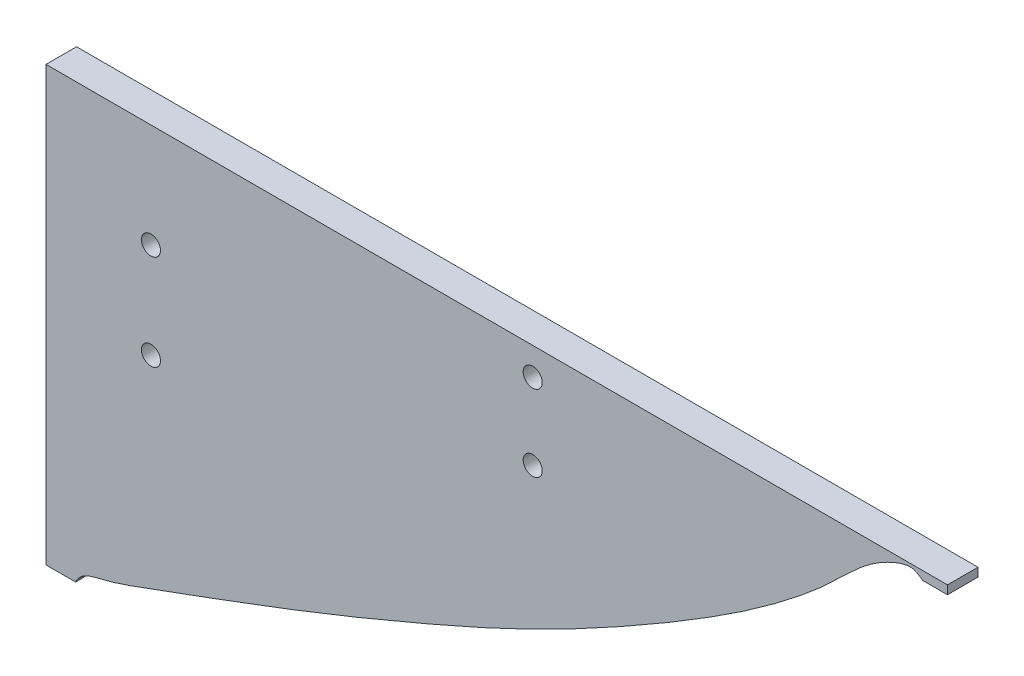
ISO-10303-21;
HEADER;
FILE_DESCRIPTION(('STEP AP214'),'2;1');
FILE_NAME('part.step','',(''),(''),'','','');
FILE_SCHEMA(('AUTOMOTIVE_DESIGN { 1 0 10303 214 1 1 1 1 }'));
ENDSEC;
DATA;
#1=APPLICATION_CONTEXT('core data for automotive mechanical design processes');
#2=APPLICATION_PROTOCOL_DEFINITION('international standard','automotive_design',2000,#1);
#3=PRODUCT_CONTEXT('',#1,'mechanical');
#4=PRODUCT('Part','Part','',(#3));
#5=PRODUCT_RELATED_PRODUCT_CATEGORY('part','',(#4));
#6=PRODUCT_DEFINITION_FORMATION('','',#4);
#7=PRODUCT_DEFINITION_CONTEXT('part definition',#1,'design');
#8=PRODUCT_DEFINITION('design','',#6,#7);
#9=PRODUCT_DEFINITION_SHAPE('','',#8);
#10=(LENGTH_UNIT() NAMED_UNIT(*) SI_UNIT(.MILLI.,.METRE.));
#11=(NAMED_UNIT(*) PLANE_ANGLE_UNIT() SI_UNIT($,.RADIAN.));
#12=(NAMED_UNIT(*) SI_UNIT($,.STERADIAN.) SOLID_ANGLE_UNIT());
#13=UNCERTAINTY_MEASURE_WITH_UNIT(LENGTH_MEASURE(1.E-05),#10,'distance_accuracy_value','');
#14=(GEOMETRIC_REPRESENTATION_CONTEXT(3) GLOBAL_UNCERTAINTY_ASSIGNED_CONTEXT((#13)) GLOBAL_UNIT_ASSIGNED_CONTEXT((#10,
#11,#12)) REPRESENTATION_CONTEXT('',''));
#15=CARTESIAN_POINT('',(0.,0.,0.));
#16=DIRECTION('',(0.,0.,1.));
#17=DIRECTION('',(1.,0.,0.));
#18=AXIS2_PLACEMENT_3D('',#15,#16,#17);
#19=CARTESIAN_POINT('',(-3.61159474341187,-63.9753690741576,140.));
#20=DIRECTION('',(0.,0.,-1.));
#21=DIRECTION('',(-1.,0.,0.));
#22=AXIS2_PLACEMENT_3D('',#19,#20,#21);
#23=PLANE('',#22);
#24=CARTESIAN_POINT('',(-100.,-50.,140.));
#25=DIRECTION('',(0.,0.,-1.));
#26=DIRECTION('',(-1.,0.,0.));
#27=AXIS2_PLACEMENT_3D('',#24,#25,#26);
#28=CIRCLE('',#27,2.5);
#29=CARTESIAN_POINT('',(-102.5,-50.,140.));
#30=VERTEX_POINT('',#29);
#31=EDGE_CURVE('E249',#30,#30,#28,.F.);
#32=ORIENTED_EDGE('',*,*,#31,.F.);
#33=EDGE_LOOP('',(#32));
#34=FACE_BOUND('',#33,.T.);
#35=CARTESIAN_POINT('',(0.0705666698621599,-4.96037406111782,140.));
#36=DIRECTION('',(0.,0.,-1.));
#37=DIRECTION('',(-1.,0.,0.));
#38=AXIS2_PLACEMENT_3D('',#35,#36,#37);
#39=CIRCLE('',#38,2.5);
#40=CARTESIAN_POINT('',(-2.42943333013784,-4.96037406111782,140.));
#41=VERTEX_POINT('',#40);
#42=EDGE_CURVE('E159',#41,#41,#39,.F.);
#43=ORIENTED_EDGE('',*,*,#42,.F.);
#44=EDGE_LOOP('',(#43));
#45=FACE_BOUND('',#44,.T.);
#46=DIRECTION('',(0.,1.,0.));
#47=VECTOR('',#46,1.);
#48=CARTESIAN_POINT('',(108.786516313984,2.25600000000004,140.));
#49=LINE('',#48,#47);
#50=CARTESIAN_POINT('',(108.786516313984,0.,140.));
#51=VERTEX_POINT('',#50);
#52=CARTESIAN_POINT('',(108.786516313984,2.25600000000004,140.));
#53=VERTEX_POINT('',#52);
#54=EDGE_CURVE('E211',#51,#53,#49,.T.);
#55=ORIENTED_EDGE('',*,*,#54,.T.);
#56=DIRECTION('',(-1.,0.,0.));
#57=VECTOR('',#56,1.);
#58=CARTESIAN_POINT('',(108.786516313984,2.25600000000004,140.));
#59=LINE('',#58,#57);
#60=CARTESIAN_POINT('',(-127.502140708611,2.25600000000001,140.));
#61=VERTEX_POINT('',#60);
#62=EDGE_CURVE('E87',#53,#61,#59,.T.);
#63=ORIENTED_EDGE('',*,*,#62,.T.);
#64=DIRECTION('',(0.,-1.,0.));
#65=VECTOR('',#64,1.);
#66=CARTESIAN_POINT('',(-127.502140708611,-111.370677064172,140.));
#67=LINE('',#66,#65);
#68=CARTESIAN_POINT('',(-127.502140708611,-111.370677064172,140.));
#69=VERTEX_POINT('',#68);
#70=EDGE_CURVE('E102',#61,#69,#67,.T.);
#71=ORIENTED_EDGE('',*,*,#70,.T.);
#72=CARTESIAN_POINT('',(-119.74478065579,-111.369623198135,140.));
#73=CARTESIAN_POINT('',(-122.33056733205,-111.370029206973,140.));
#74=CARTESIAN_POINT('',(-124.916354017888,-111.370376979131,140.));
#75=CARTESIAN_POINT('',(-127.502140708611,-111.370677064172,140.));
#76=B_SPLINE_CURVE_WITH_KNOTS('',3,(#72,#73,#74,#75),.UNSPECIFIED.,.F.,.F.,(4,4),(0.,1.),.UNSPECIFIED.);
#77=CARTESIAN_POINT('',(-119.74478065579,-111.369623198135,140.));
#78=VERTEX_POINT('',#77);
#79=EDGE_CURVE('E94',#69,#78,#76,.F.);
#80=ORIENTED_EDGE('',*,*,#79,.T.);
#81=CARTESIAN_POINT('',(102.174797509029,0.,140.));
#82=CARTESIAN_POINT('',(102.133483717074,0.0740132089605751,140.));
#83=CARTESIAN_POINT('',(102.080289045133,0.140652841544253,140.));
#84=CARTESIAN_POINT('',(101.960367932638,0.256861211528158,140.));
#85=CARTESIAN_POINT('',(101.892843610553,0.308133850127482,140.));
#86=CARTESIAN_POINT('',(101.682744439321,0.449626580587533,140.));
#87=CARTESIAN_POINT('',(101.535216022822,0.530744330762291,140.));
#88=CARTESIAN_POINT('',(101.24171924607,0.695741645294269,140.));
#89=CARTESIAN_POINT('',(101.096806934001,0.781490763304865,140.));
#90=CARTESIAN_POINT('',(100.803143544977,0.946193119155457,140.));
#91=CARTESIAN_POINT('',(100.653733980813,1.02406959336661,140.));
#92=CARTESIAN_POINT('',(100.347394283555,1.16614949719639,140.));
#93=CARTESIAN_POINT('',(100.192277101721,1.23019568188978,140.));
#94=CARTESIAN_POINT('',(99.8746202433582,1.33163046646111,140.));
#95=CARTESIAN_POINT('',(99.7118274622071,1.36811005148065,140.));
#96=CARTESIAN_POINT('',(99.3793086565314,1.41616876272523,140.));
#97=CARTESIAN_POINT('',(99.2092485318201,1.42753759296677,140.));
#98=CARTESIAN_POINT('',(98.8737996067316,1.42995122333902,140.));
#99=CARTESIAN_POINT('',(98.706936582404,1.42128728519534,140.));
#100=CARTESIAN_POINT('',(98.2081520573723,1.3746181344735,140.));
#101=CARTESIAN_POINT('',(97.8771901097739,1.31615779783525,140.));
#102=CARTESIAN_POINT('',(97.2213830471569,1.17085607371846,140.));
#103=CARTESIAN_POINT('',(96.8986344729087,1.08531081085428,140.));
#104=CARTESIAN_POINT('',(95.9439884980412,0.794657163736857,140.));
#105=CARTESIAN_POINT('',(95.3253745670236,0.556322046626228,140.));
#106=CARTESIAN_POINT('',(94.1046623164088,0.0383403309097071,140.));
#107=CARTESIAN_POINT('',(93.5032345124068,-0.242983468248972,140.));
#108=CARTESIAN_POINT('',(92.3163076954642,-0.845474699382162,140.));
#109=CARTESIAN_POINT('',(91.7300057379359,-1.16646129385629,140.));
#110=CARTESIAN_POINT('',(90.0135710426429,-2.17120472621133,140.));
#111=CARTESIAN_POINT('',(88.919928274615,-2.90231753187035,140.));
#112=CARTESIAN_POINT('',(85.7848974565751,-5.27219463169157,140.));
#113=CARTESIAN_POINT('',(83.8770332247598,-7.0725252395165,140.));
#114=CARTESIAN_POINT('',(81.0435520177798,-9.8072830003568,140.));
#115=CARTESIAN_POINT('',(80.1025509449095,-10.7230951078402,140.));
#116=CARTESIAN_POINT('',(78.2014452980655,-12.5316037297015,140.));
#117=CARTESIAN_POINT('',(77.243373040822,-13.4267857661852,140.));
#118=CARTESIAN_POINT('',(74.3283252422101,-16.063705788647,140.));
#119=CARTESIAN_POINT('',(72.3290518891755,-17.7549116877814,140.));
#120=CARTESIAN_POINT('',(68.2559270942026,-21.048295327208,140.));
#121=CARTESIAN_POINT('',(66.1816658174121,-22.6515308736018,140.));
#122=CARTESIAN_POINT('',(61.982110533295,-25.7897382581012,140.));
#123=CARTESIAN_POINT('',(59.8569630186666,-27.3226511480434,140.));
#124=CARTESIAN_POINT('',(55.555992374383,-30.3161868066359,140.));
#125=CARTESIAN_POINT('',(53.3809358441623,-31.7779031498993,140.));
#126=CARTESIAN_POINT('',(48.9928852507356,-34.6472169301322,140.));
#127=CARTESIAN_POINT('',(46.7816843210135,-36.0536849455855,140.));
#128=CARTESIAN_POINT('',(42.3346829322996,-38.8248264189556,140.));
#129=CARTESIAN_POINT('',(40.0986199495687,-40.1893479535107,140.));
#130=CARTESIAN_POINT('',(33.3588953701936,-44.2300718759803,140.));
#131=CARTESIAN_POINT('',(28.8240750067326,-46.8540650515823,140.));
#132=CARTESIAN_POINT('',(19.6855545492033,-51.9866374488106,140.));
#133=CARTESIAN_POINT('',(15.0829470316964,-54.4957440074979,140.));
#134=CARTESIAN_POINT('',(5.79784972716676,-59.3595796697837,140.));
#135=CARTESIAN_POINT('',(1.11213889469716,-61.7102921616398,140.));
#136=CARTESIAN_POINT('',(-8.33532838152074,-66.2404459866754,140.));
#137=CARTESIAN_POINT('',(-13.0983568872768,-68.4210035397232,140.));
#138=CARTESIAN_POINT('',(-22.6736995755035,-72.6761100478421,140.));
#139=CARTESIAN_POINT('',(-27.4844054407837,-74.7552226744045,140.));
#140=CARTESIAN_POINT('',(-37.1311154412859,-78.8495408189413,140.));
#141=CARTESIAN_POINT('',(-41.9675654728444,-80.8649999836434,140.));
#142=CARTESIAN_POINT('',(-51.672461525571,-84.8184637511377,140.));
#143=CARTESIAN_POINT('',(-56.5423406788934,-86.7538360969285,140.));
#144=CARTESIAN_POINT('',(-66.3118463822937,-90.548245071103,140.));
#145=CARTESIAN_POINT('',(-71.2110591590051,-92.4078761235427,140.));
#146=CARTESIAN_POINT('',(-78.5718798064042,-95.1656601478632,140.));
#147=CARTESIAN_POINT('',(-81.0275083769149,-96.0795167110985,140.));
#148=CARTESIAN_POINT('',(-85.9403520987066,-97.9029355462761,140.));
#149=CARTESIAN_POINT('',(-88.3973104367218,-98.8132039783722,140.));
#150=CARTESIAN_POINT('',(-93.312744362029,-100.629628613156,140.));
#151=CARTESIAN_POINT('',(-95.7712928057153,-101.535609961062,140.));
#152=CARTESIAN_POINT('',(-99.4626593251663,-102.884866273119,140.));
#153=CARTESIAN_POINT('',(-100.69371676107,-103.332970238365,140.));
#154=CARTESIAN_POINT('',(-103.156990240713,-104.226005792775,140.));
#155=CARTESIAN_POINT('',(-104.388100762522,-104.674145593749,140.));
#156=CARTESIAN_POINT('',(-106.857762939829,-105.548456156039,140.));
#157=CARTESIAN_POINT('',(-108.097693482176,-105.970598015397,140.));
#158=CARTESIAN_POINT('',(-109.976916117696,-106.546910252338,140.));
#159=CARTESIAN_POINT('',(-110.606427500648,-106.729945577892,140.));
#160=CARTESIAN_POINT('',(-111.871993216429,-107.076042406591,140.));
#161=CARTESIAN_POINT('',(-112.509038771457,-107.236165773565,140.));
#162=CARTESIAN_POINT('',(-113.786492947709,-107.546215257163,140.));
#163=CARTESIAN_POINT('',(-114.425452848892,-107.70053407975,140.));
#164=CARTESIAN_POINT('',(-115.370510342413,-107.972589349444,140.));
#165=CARTESIAN_POINT('',(-115.683388723629,-108.069765570323,140.));
#166=CARTESIAN_POINT('',(-116.302297956525,-108.284880604589,140.));
#167=CARTESIAN_POINT('',(-116.608327300279,-108.402823990201,140.));
#168=CARTESIAN_POINT('',(-117.207461970392,-108.677898048651,140.));
#169=CARTESIAN_POINT('',(-117.500692980927,-108.83464763086,140.));
#170=CARTESIAN_POINT('',(-117.924337844786,-109.118897501988,140.));
#171=CARTESIAN_POINT('',(-118.063744988598,-109.222794624144,140.));
#172=CARTESIAN_POINT('',(-118.32701596136,-109.444739249125,140.));
#173=CARTESIAN_POINT('',(-118.451542423171,-109.563302164607,140.));
#174=CARTESIAN_POINT('',(-118.691270778487,-109.810384227313,140.));
#175=CARTESIAN_POINT('',(-118.806684566981,-109.939052028247,140.));
#176=CARTESIAN_POINT('',(-119.02718004617,-110.204247675914,140.));
#177=CARTESIAN_POINT('',(-119.13232458796,-110.340968484277,140.));
#178=CARTESIAN_POINT('',(-119.342404107642,-110.614579412235,140.));
#179=CARTESIAN_POINT('',(-119.446791943074,-110.751864701503,140.));
#180=CARTESIAN_POINT('',(-119.585429033565,-110.968914708787,140.));
#181=CARTESIAN_POINT('',(-119.628601757216,-111.043157014422,140.));
#182=CARTESIAN_POINT('',(-119.700690023492,-111.200517318455,140.));
#183=CARTESIAN_POINT('',(-119.729517492933,-111.284383760386,140.));
#184=CARTESIAN_POINT('',(-119.74478065579,-111.369623198135,140.));
#185=B_SPLINE_CURVE_WITH_KNOTS('',3,(#81,#82,#83,#84,#85,#86,#87,#88,#89,#90,#91,#92,#93,#94,
#95,#96,#97,#98,#99,#100,#101,#102,#103,#104,#105,#106,#107,#108,#109,#110,#111,#112,#113,#114,
#115,#116,#117,#118,#119,#120,#121,#122,#123,#124,#125,#126,#127,#128,#129,#130,#131,#132,#133,
#134,#135,#136,#137,#138,#139,#140,#141,#142,#143,#144,#145,#146,#147,#148,#149,#150,#151,#152,
#153,#154,#155,#156,#157,#158,#159,#160,#161,#162,#163,#164,#165,#166,#167,#168,#169,#170,#171,
#172,#173,#174,#175,#176,#177,#178,#179,#180,#181,#182,#183,#184),.UNSPECIFIED.,.F.,.F.,(4,2,2,
2,2,2,2,2,2,2,2,2,2,2,2,2,2,2,2,2,2,2,2,2,2,2,2,2,2,2,2,2,2,2,2,2,2,2,2,2,2,2,2,2,2,2,2,2,2,2,2,
4),(0.,0.0009765625,0.001953125,0.00390625,0.00585937499999989,0.00781249999999989,
0.00976562499999989,0.0117187499999999,0.0136718749999999,0.0156249999999999,0.0195312499999998,
0.0234374999999998,0.0312499999999997,0.0390624999999996,0.0468749999999996,0.0624999999999993,
0.0937499999999991,0.109374999999999,0.124999999999999,0.156249999999999,0.187499999999999,
0.218749999999999,0.249999999999999,0.281249999999999,0.312499999999999,0.375,0.4375,0.5,0.5625,
0.625,0.6875,0.75,0.8125,0.84375,0.875,0.90625,0.921875,0.9375,0.953125,0.9609375,
0.968749999999999,0.976562499999999,0.980468749999999,0.984374999999999,0.98828125,0.990234375,
0.9921875,0.994140625,0.99609375,0.998046875,0.9990234375,1.),.UNSPECIFIED.);
#186=CARTESIAN_POINT('',(102.174797509029,0.,140.));
#187=VERTEX_POINT('',#186);
#188=EDGE_CURVE('E99',#78,#187,#185,.F.);
#189=ORIENTED_EDGE('',*,*,#188,.T.);
#190=DIRECTION('',(1.,0.,0.));
#191=VECTOR('',#190,1.);
#192=CARTESIAN_POINT('',(102.174797509029,0.,140.));
#193=LINE('',#192,#191);
#194=EDGE_CURVE('E49',#187,#51,#193,.T.);
#195=ORIENTED_EDGE('',*,*,#194,.T.);
#196=EDGE_LOOP('',(#55,#63,#71,#80,#189,#195));
#197=FACE_BOUND('',#196,.T.);
#198=CARTESIAN_POINT('',(0.0705666698621599,-25.,140.));
#199=DIRECTION('',(0.,0.,-1.));
#200=DIRECTION('',(-1.,0.,0.));
#201=AXIS2_PLACEMENT_3D('',#198,#199,#200);
#202=CIRCLE('',#201,2.5);
#203=CARTESIAN_POINT('',(-2.42943333013784,-25.,140.));
#204=VERTEX_POINT('',#203);
#205=EDGE_CURVE('E256',#204,#204,#202,.F.);
#206=ORIENTED_EDGE('',*,*,#205,.F.);
#207=EDGE_LOOP('',(#206));
#208=FACE_BOUND('',#207,.T.);
#209=CARTESIAN_POINT('',(-100.,-25.,140.));
#210=DIRECTION('',(0.,0.,-1.));
#211=DIRECTION('',(-1.,0.,0.));
#212=AXIS2_PLACEMENT_3D('',#209,#210,#211);
#213=CIRCLE('',#212,2.5);
#214=CARTESIAN_POINT('',(-102.5,-25.,140.));
#215=VERTEX_POINT('',#214);
#216=EDGE_CURVE('E279',#215,#215,#213,.F.);
#217=ORIENTED_EDGE('',*,*,#216,.F.);
#218=EDGE_LOOP('',(#217));
#219=FACE_BOUND('',#218,.T.);
#220=ADVANCED_FACE('F30',(#34,#45,#197,#208,#219),#23,.F.);
#221=CARTESIAN_POINT('',(-3.61159474341187,-63.9753690741576,132.));
#222=DIRECTION('',(0.,0.,-1.));
#223=DIRECTION('',(-1.,0.,0.));
#224=AXIS2_PLACEMENT_3D('',#221,#222,#223);
#225=PLANE('',#224);
#226=CARTESIAN_POINT('',(-100.,-50.,132.));
#227=DIRECTION('',(0.,0.,-1.));
#228=DIRECTION('',(-1.,0.,0.));
#229=AXIS2_PLACEMENT_3D('',#226,#227,#228);
#230=CIRCLE('',#229,2.5);
#231=CARTESIAN_POINT('',(-102.5,-50.,132.));
#232=VERTEX_POINT('',#231);
#233=EDGE_CURVE('E278',#232,#232,#230,.F.);
#234=ORIENTED_EDGE('',*,*,#233,.T.);
#235=EDGE_LOOP('',(#234));
#236=FACE_BOUND('',#235,.T.);
#237=CARTESIAN_POINT('',(0.0705666698621599,-4.96037406111782,132.));
#238=DIRECTION('',(0.,0.,-1.));
#239=DIRECTION('',(-1.,0.,0.));
#240=AXIS2_PLACEMENT_3D('',#237,#238,#239);
#241=CIRCLE('',#240,2.5);
#242=CARTESIAN_POINT('',(-2.42943333013784,-4.96037406111782,132.));
#243=VERTEX_POINT('',#242);
#244=EDGE_CURVE('E253',#243,#243,#241,.F.);
#245=ORIENTED_EDGE('',*,*,#244,.T.);
#246=EDGE_LOOP('',(#245));
#247=FACE_BOUND('',#246,.T.);
#248=DIRECTION('',(0.,1.,0.));
#249=VECTOR('',#248,1.);
#250=CARTESIAN_POINT('',(108.786516313984,2.25600000000004,132.));
#251=LINE('',#250,#249);
#252=CARTESIAN_POINT('',(108.786516313984,0.,132.));
#253=VERTEX_POINT('',#252);
#254=CARTESIAN_POINT('',(108.786516313984,2.25600000000004,132.));
#255=VERTEX_POINT('',#254);
#256=EDGE_CURVE('E152',#253,#255,#251,.T.);
#257=ORIENTED_EDGE('',*,*,#256,.F.);
#258=DIRECTION('',(1.,0.,0.));
#259=VECTOR('',#258,1.);
#260=CARTESIAN_POINT('',(102.174797509029,0.,132.));
#261=LINE('',#260,#259);
#262=CARTESIAN_POINT('',(102.174797509029,0.,132.));
#263=VERTEX_POINT('',#262);
#264=EDGE_CURVE('E79',#263,#253,#261,.T.);
#265=ORIENTED_EDGE('',*,*,#264,.F.);
#266=CARTESIAN_POINT('',(-119.74478065579,-111.369623198135,132.));
#267=CARTESIAN_POINT('',(-119.729517492933,-111.284383760386,132.));
#268=CARTESIAN_POINT('',(-119.700690023492,-111.200517318455,132.));
#269=CARTESIAN_POINT('',(-119.628601757216,-111.043157014422,132.));
#270=CARTESIAN_POINT('',(-119.585429033565,-110.968914708787,132.));
#271=CARTESIAN_POINT('',(-119.446791943074,-110.751864701503,132.));
#272=CARTESIAN_POINT('',(-119.342404107642,-110.614579412235,132.));
#273=CARTESIAN_POINT('',(-119.13232458796,-110.340968484277,132.));
#274=CARTESIAN_POINT('',(-119.02718004617,-110.204247675914,132.));
#275=CARTESIAN_POINT('',(-118.806684566981,-109.939052028247,132.));
#276=CARTESIAN_POINT('',(-118.691270778487,-109.810384227313,132.));
#277=CARTESIAN_POINT('',(-118.451542423171,-109.563302164607,132.));
#278=CARTESIAN_POINT('',(-118.32701596136,-109.444739249125,132.));
#279=CARTESIAN_POINT('',(-118.063744988598,-109.222794624144,132.));
#280=CARTESIAN_POINT('',(-117.924337844786,-109.118897501988,132.));
#281=CARTESIAN_POINT('',(-117.500692980927,-108.83464763086,132.));
#282=CARTESIAN_POINT('',(-117.207461970392,-108.677898048651,132.));
#283=CARTESIAN_POINT('',(-116.608327300279,-108.402823990201,132.));
#284=CARTESIAN_POINT('',(-116.302297956525,-108.284880604589,132.));
#285=CARTESIAN_POINT('',(-115.683388723629,-108.069765570323,132.));
#286=CARTESIAN_POINT('',(-115.370510342413,-107.972589349444,132.));
#287=CARTESIAN_POINT('',(-114.425452848892,-107.70053407975,132.));
#288=CARTESIAN_POINT('',(-113.786492947709,-107.546215257163,132.));
#289=CARTESIAN_POINT('',(-112.509038771457,-107.236165773565,132.));
#290=CARTESIAN_POINT('',(-111.871993216429,-107.076042406591,132.));
#291=CARTESIAN_POINT('',(-110.606427500648,-106.729945577892,132.));
#292=CARTESIAN_POINT('',(-109.976916117696,-106.546910252338,132.));
#293=CARTESIAN_POINT('',(-108.097693482176,-105.970598015397,132.));
#294=CARTESIAN_POINT('',(-106.857762939829,-105.548456156039,132.));
#295=CARTESIAN_POINT('',(-104.388100762522,-104.674145593749,132.));
#296=CARTESIAN_POINT('',(-103.156990240713,-104.226005792775,132.));
#297=CARTESIAN_POINT('',(-100.69371676107,-103.332970238365,132.));
#298=CARTESIAN_POINT('',(-99.4626593251663,-102.884866273119,132.));
#299=CARTESIAN_POINT('',(-95.7712928057153,-101.535609961062,132.));
#300=CARTESIAN_POINT('',(-93.312744362029,-100.629628613156,132.));
#301=CARTESIAN_POINT('',(-88.3973104367218,-98.8132039783722,132.));
#302=CARTESIAN_POINT('',(-85.9403520987066,-97.9029355462761,132.));
#303=CARTESIAN_POINT('',(-81.0275083769149,-96.0795167110985,132.));
#304=CARTESIAN_POINT('',(-78.5718798064042,-95.1656601478632,132.));
#305=CARTESIAN_POINT('',(-71.2110591590051,-92.4078761235427,132.));
#306=CARTESIAN_POINT('',(-66.3118463822937,-90.548245071103,132.));
#307=CARTESIAN_POINT('',(-56.5423406788934,-86.7538360969285,132.));
#308=CARTESIAN_POINT('',(-51.672461525571,-84.8184637511377,132.));
#309=CARTESIAN_POINT('',(-41.9675654728444,-80.8649999836434,132.));
#310=CARTESIAN_POINT('',(-37.1311154412859,-78.8495408189413,132.));
#311=CARTESIAN_POINT('',(-27.4844054407837,-74.7552226744045,132.));
#312=CARTESIAN_POINT('',(-22.6736995755035,-72.6761100478421,132.));
#313=CARTESIAN_POINT('',(-13.0983568872768,-68.4210035397232,132.));
#314=CARTESIAN_POINT('',(-8.33532838152074,-66.2404459866754,132.));
#315=CARTESIAN_POINT('',(1.11213889469716,-61.7102921616398,132.));
#316=CARTESIAN_POINT('',(5.79784972716676,-59.3595796697837,132.));
#317=CARTESIAN_POINT('',(15.0829470316964,-54.4957440074979,132.));
#318=CARTESIAN_POINT('',(19.6855545492033,-51.9866374488106,132.));
#319=CARTESIAN_POINT('',(28.8240750067326,-46.8540650515823,132.));
#320=CARTESIAN_POINT('',(33.3588953701936,-44.2300718759803,132.));
#321=CARTESIAN_POINT('',(40.0986199495687,-40.1893479535107,132.));
#322=CARTESIAN_POINT('',(42.3346829322996,-38.8248264189556,132.));
#323=CARTESIAN_POINT('',(46.7816843210135,-36.0536849455855,132.));
#324=CARTESIAN_POINT('',(48.9928852507356,-34.6472169301322,132.));
#325=CARTESIAN_POINT('',(53.3809358441623,-31.7779031498993,132.));
#326=CARTESIAN_POINT('',(55.555992374383,-30.3161868066359,132.));
#327=CARTESIAN_POINT('',(59.8569630186666,-27.3226511480434,132.));
#328=CARTESIAN_POINT('',(61.982110533295,-25.7897382581012,132.));
#329=CARTESIAN_POINT('',(66.1816658174121,-22.6515308736018,132.));
#330=CARTESIAN_POINT('',(68.2559270942026,-21.048295327208,132.));
#331=CARTESIAN_POINT('',(72.3290518891755,-17.7549116877814,132.));
#332=CARTESIAN_POINT('',(74.3283252422101,-16.063705788647,132.));
#333=CARTESIAN_POINT('',(77.243373040822,-13.4267857661852,132.));
#334=CARTESIAN_POINT('',(78.2014452980655,-12.5316037297015,132.));
#335=CARTESIAN_POINT('',(80.1025509449095,-10.7230951078402,132.));
#336=CARTESIAN_POINT('',(81.0435520177798,-9.8072830003568,132.));
#337=CARTESIAN_POINT('',(83.8770332247598,-7.0725252395165,132.));
#338=CARTESIAN_POINT('',(85.7848974565751,-5.27219463169157,132.));
#339=CARTESIAN_POINT('',(88.919928274615,-2.90231753187035,132.));
#340=CARTESIAN_POINT('',(90.0135710426429,-2.17120472621133,132.));
#341=CARTESIAN_POINT('',(91.7300057379359,-1.16646129385629,132.));
#342=CARTESIAN_POINT('',(92.3163076954642,-0.845474699382162,132.));
#343=CARTESIAN_POINT('',(93.5032345124068,-0.242983468248972,132.));
#344=CARTESIAN_POINT('',(94.1046623164088,0.0383403309097071,132.));
#345=CARTESIAN_POINT('',(95.3253745670236,0.556322046626228,132.));
#346=CARTESIAN_POINT('',(95.9439884980412,0.794657163736857,132.));
#347=CARTESIAN_POINT('',(96.8986344729087,1.08531081085428,132.));
#348=CARTESIAN_POINT('',(97.2213830471569,1.17085607371846,132.));
#349=CARTESIAN_POINT('',(97.8771901097739,1.31615779783525,132.));
#350=CARTESIAN_POINT('',(98.2081520573723,1.3746181344735,132.));
#351=CARTESIAN_POINT('',(98.706936582404,1.42128728519534,132.));
#352=CARTESIAN_POINT('',(98.8737996067316,1.42995122333902,132.));
#353=CARTESIAN_POINT('',(99.2092485318201,1.42753759296677,132.));
#354=CARTESIAN_POINT('',(99.3793086565314,1.41616876272523,132.));
#355=CARTESIAN_POINT('',(99.7118274622071,1.36811005148065,132.));
#356=CARTESIAN_POINT('',(99.8746202433582,1.33163046646111,132.));
#357=CARTESIAN_POINT('',(100.192277101721,1.23019568188978,132.));
#358=CARTESIAN_POINT('',(100.347394283555,1.16614949719639,132.));
#359=CARTESIAN_POINT('',(100.653733980813,1.02406959336661,132.));
#360=CARTESIAN_POINT('',(100.803143544977,0.946193119155457,132.));
#361=CARTESIAN_POINT('',(101.096806934001,0.781490763304865,132.));
#362=CARTESIAN_POINT('',(101.24171924607,0.695741645294269,132.));
#363=CARTESIAN_POINT('',(101.535216022822,0.530744330762291,132.));
#364=CARTESIAN_POINT('',(101.682744439321,0.449626580587533,132.));
#365=CARTESIAN_POINT('',(101.892843610553,0.308133850127482,132.));
#366=CARTESIAN_POINT('',(101.960367932638,0.256861211528158,132.));
#367=CARTESIAN_POINT('',(102.080289045133,0.140652841544253,132.));
#368=CARTESIAN_POINT('',(102.133483717074,0.0740132089605751,132.));
#369=CARTESIAN_POINT('',(102.174797509029,0.,132.));
#370=B_SPLINE_CURVE_WITH_KNOTS('',3,(#266,#267,#268,#269,#270,#271,#272,#273,#274,#275,#276,
#277,#278,#279,#280,#281,#282,#283,#284,#285,#286,#287,#288,#289,#290,#291,#292,#293,#294,#295,
#296,#297,#298,#299,#300,#301,#302,#303,#304,#305,#306,#307,#308,#309,#310,#311,#312,#313,#314,
#315,#316,#317,#318,#319,#320,#321,#322,#323,#324,#325,#326,#327,#328,#329,#330,#331,#332,#333,
#334,#335,#336,#337,#338,#339,#340,#341,#342,#343,#344,#345,#346,#347,#348,#349,#350,#351,#352,
#353,#354,#355,#356,#357,#358,#359,#360,#361,#362,#363,#364,#365,#366,#367,#368,#369),
.UNSPECIFIED.,.F.,.F.,(4,2,2,2,2,2,2,2,2,2,2,2,2,2,2,2,2,2,2,2,2,2,2,2,2,2,2,2,2,2,2,2,2,2,2,2,
2,2,2,2,2,2,2,2,2,2,2,2,2,2,2,4),(0.,0.0009765625,0.001953125,0.00390625000000011,
0.00585937500000011,0.00781250000000022,0.00976562500000033,0.0117187500000004,
0.0156250000000006,0.0195312500000006,0.0234375000000007,0.0312500000000006,0.0390625000000004,
0.0468750000000004,0.0625000000000003,0.0781250000000003,0.0937500000000002,0.125,0.15625,
0.1875,0.25,0.3125,0.375,0.4375,0.5,0.5625,0.625,0.687500000000001,0.718750000000001,
0.750000000000001,0.781250000000001,0.812500000000001,0.843750000000001,0.875000000000001,
0.890625000000001,0.906250000000001,0.937500000000001,0.953125,0.9609375,0.96875,0.9765625,
0.98046875,0.984375,0.986328125,0.98828125,0.990234375,0.9921875,0.994140625,0.99609375,
0.998046875,0.9990234375,1.),.UNSPECIFIED.);
#371=CARTESIAN_POINT('',(-119.74478065579,-111.369623198135,132.));
#372=VERTEX_POINT('',#371);
#373=EDGE_CURVE('E72',#372,#263,#370,.T.);
#374=ORIENTED_EDGE('',*,*,#373,.F.);
#375=CARTESIAN_POINT('',(-127.502140708611,-111.370677064172,132.));
#376=CARTESIAN_POINT('',(-124.916354017888,-111.370376979131,132.));
#377=CARTESIAN_POINT('',(-122.33056733205,-111.370029206973,132.));
#378=CARTESIAN_POINT('',(-119.74478065579,-111.369623198135,132.));
#379=B_SPLINE_CURVE_WITH_KNOTS('',3,(#375,#376,#377,#378),.UNSPECIFIED.,.F.,.F.,(4,4),(0.,1.),.UNSPECIFIED.);
#380=CARTESIAN_POINT('',(-127.502140708611,-111.370677064172,132.));
#381=VERTEX_POINT('',#380);
#382=EDGE_CURVE('E112',#381,#372,#379,.T.);
#383=ORIENTED_EDGE('',*,*,#382,.F.);
#384=DIRECTION('',(0.,-1.,0.));
#385=VECTOR('',#384,1.);
#386=CARTESIAN_POINT('',(-127.502140708611,-111.370677064172,132.));
#387=LINE('',#386,#385);
#388=CARTESIAN_POINT('',(-127.502140708611,2.25600000000001,132.));
#389=VERTEX_POINT('',#388);
#390=EDGE_CURVE('E161',#389,#381,#387,.T.);
#391=ORIENTED_EDGE('',*,*,#390,.F.);
#392=DIRECTION('',(-1.,0.,0.));
#393=VECTOR('',#392,1.);
#394=CARTESIAN_POINT('',(108.786516313984,2.25600000000004,132.));
#395=LINE('',#394,#393);
#396=EDGE_CURVE('E158',#255,#389,#395,.T.);
#397=ORIENTED_EDGE('',*,*,#396,.F.);
#398=EDGE_LOOP('',(#257,#265,#374,#383,#391,#397));
#399=FACE_BOUND('',#398,.T.);
#400=CARTESIAN_POINT('',(0.0705666698621599,-25.,132.));
#401=DIRECTION('',(0.,0.,-1.));
#402=DIRECTION('',(-1.,0.,0.));
#403=AXIS2_PLACEMENT_3D('',#400,#401,#402);
#404=CIRCLE('',#403,2.5);
#405=CARTESIAN_POINT('',(-2.42943333013784,-25.,132.));
#406=VERTEX_POINT('',#405);
#407=EDGE_CURVE('E276',#406,#406,#404,.F.);
#408=ORIENTED_EDGE('',*,*,#407,.T.);
#409=EDGE_LOOP('',(#408));
#410=FACE_BOUND('',#409,.T.);
#411=CARTESIAN_POINT('',(-100.,-25.,132.));
#412=DIRECTION('',(0.,0.,-1.));
#413=DIRECTION('',(-1.,0.,0.));
#414=AXIS2_PLACEMENT_3D('',#411,#412,#413);
#415=CIRCLE('',#414,2.5);
#416=CARTESIAN_POINT('',(-102.5,-25.,132.));
#417=VERTEX_POINT('',#416);
#418=EDGE_CURVE('E34',#417,#417,#415,.F.);
#419=ORIENTED_EDGE('',*,*,#418,.T.);
#420=EDGE_LOOP('',(#419));
#421=FACE_BOUND('',#420,.T.);
#422=ADVANCED_FACE('F188',(#236,#247,#399,#410,#421),#225,.T.);
#423=CARTESIAN_POINT('',(108.786516313984,2.25600000000004,140.));
#424=DIRECTION('',(-1.,0.,0.));
#425=DIRECTION('',(0.,0.,1.));
#426=AXIS2_PLACEMENT_3D('',#423,#424,#425);
#427=PLANE('',#426);
#428=ORIENTED_EDGE('',*,*,#256,.T.);
#429=DIRECTION('',(0.,0.,-1.));
#430=VECTOR('',#429,1.);
#431=CARTESIAN_POINT('',(108.786516313984,2.25600000000004,140.));
#432=LINE('',#431,#430);
#433=EDGE_CURVE('E11',#53,#255,#432,.T.);
#434=ORIENTED_EDGE('',*,*,#433,.F.);
#435=ORIENTED_EDGE('',*,*,#54,.F.);
#436=DIRECTION('',(0.,0.,-1.));
#437=VECTOR('',#436,1.);
#438=CARTESIAN_POINT('',(108.786516313984,0.,140.));
#439=LINE('',#438,#437);
#440=EDGE_CURVE('E162',#51,#253,#439,.T.);
#441=ORIENTED_EDGE('',*,*,#440,.T.);
#442=EDGE_LOOP('',(#428,#434,#435,#441));
#443=FACE_BOUND('',#442,.T.);
#444=ADVANCED_FACE('F32',(#443),#427,.F.);
#445=CARTESIAN_POINT('',(108.786516313984,2.25600000000004,140.));
#446=DIRECTION('',(0.,-1.,0.));
#447=DIRECTION('',(1.,0.,0.));
#448=AXIS2_PLACEMENT_3D('',#445,#446,#447);
#449=PLANE('',#448);
#450=ORIENTED_EDGE('',*,*,#396,.T.);
#451=DIRECTION('',(0.,0.,-1.));
#452=VECTOR('',#451,1.);
#453=CARTESIAN_POINT('',(-127.502140708611,2.25600000000001,140.));
#454=LINE('',#453,#452);
#455=EDGE_CURVE('E40',#61,#389,#454,.T.);
#456=ORIENTED_EDGE('',*,*,#455,.F.);
#457=ORIENTED_EDGE('',*,*,#62,.F.);
#458=ORIENTED_EDGE('',*,*,#433,.T.);
#459=EDGE_LOOP('',(#450,#456,#457,#458));
#460=FACE_BOUND('',#459,.T.);
#461=ADVANCED_FACE('F218',(#460),#449,.F.);
#462=CARTESIAN_POINT('',(-127.502140708611,-111.370677064172,140.));
#463=DIRECTION('',(1.,0.,0.));
#464=DIRECTION('',(0.,1.,0.));
#465=AXIS2_PLACEMENT_3D('',#462,#463,#464);
#466=PLANE('',#465);
#467=ORIENTED_EDGE('',*,*,#390,.T.);
#468=DIRECTION('',(0.,0.,-1.));
#469=VECTOR('',#468,1.);
#470=CARTESIAN_POINT('',(-127.502140708611,-111.370677064172,140.));
#471=LINE('',#470,#469);
#472=EDGE_CURVE('E114',#69,#381,#471,.T.);
#473=ORIENTED_EDGE('',*,*,#472,.F.);
#474=ORIENTED_EDGE('',*,*,#70,.F.);
#475=ORIENTED_EDGE('',*,*,#455,.T.);
#476=EDGE_LOOP('',(#467,#473,#474,#475));
#477=FACE_BOUND('',#476,.T.);
#478=ADVANCED_FACE('F214',(#477),#466,.F.);
#479=CARTESIAN_POINT('',(-127.502140708611,-111.370677064172,140.));
#480=CARTESIAN_POINT('',(-124.916354017888,-111.370376979131,140.));
#481=CARTESIAN_POINT('',(-122.33056733205,-111.370029206973,140.));
#482=CARTESIAN_POINT('',(-119.74478065579,-111.369623198135,140.));
#483=B_SPLINE_CURVE_WITH_KNOTS('',3,(#479,#480,#481,#482),.UNSPECIFIED.,.F.,.F.,(4,4),(0.,1.),.UNSPECIFIED.);
#484=DIRECTION('',(0.,0.,-1.));
#485=VECTOR('',#484,1.);
#486=SURFACE_OF_LINEAR_EXTRUSION('',#483,#485);
#487=ORIENTED_EDGE('',*,*,#382,.T.);
#488=DIRECTION('',(0.,0.,-1.));
#489=VECTOR('',#488,1.);
#490=CARTESIAN_POINT('',(-119.74478065579,-111.369623198135,140.));
#491=LINE('',#490,#489);
#492=EDGE_CURVE('E109',#78,#372,#491,.T.);
#493=ORIENTED_EDGE('',*,*,#492,.F.);
#494=ORIENTED_EDGE('',*,*,#79,.F.);
#495=ORIENTED_EDGE('',*,*,#472,.T.);
#496=EDGE_LOOP('',(#487,#493,#494,#495));
#497=FACE_BOUND('',#496,.T.);
#498=ADVANCED_FACE('F110',(#497),#486,.F.);
#499=CARTESIAN_POINT('',(-119.74478065579,-111.369623198135,140.));
#500=CARTESIAN_POINT('',(-119.729517492933,-111.284383760386,140.));
#501=CARTESIAN_POINT('',(-119.700690023492,-111.200517318455,140.));
#502=CARTESIAN_POINT('',(-119.628601757216,-111.043157014422,140.));
#503=CARTESIAN_POINT('',(-119.585429033565,-110.968914708787,140.));
#504=CARTESIAN_POINT('',(-119.446791943074,-110.751864701503,140.));
#505=CARTESIAN_POINT('',(-119.342404107642,-110.614579412235,140.));
#506=CARTESIAN_POINT('',(-119.13232458796,-110.340968484277,140.));
#507=CARTESIAN_POINT('',(-119.02718004617,-110.204247675914,140.));
#508=CARTESIAN_POINT('',(-118.806684566981,-109.939052028247,140.));
#509=CARTESIAN_POINT('',(-118.691270778487,-109.810384227313,140.));
#510=CARTESIAN_POINT('',(-118.451542423171,-109.563302164607,140.));
#511=CARTESIAN_POINT('',(-118.32701596136,-109.444739249125,140.));
#512=CARTESIAN_POINT('',(-118.063744988598,-109.222794624144,140.));
#513=CARTESIAN_POINT('',(-117.924337844786,-109.118897501988,140.));
#514=CARTESIAN_POINT('',(-117.500692980927,-108.83464763086,140.));
#515=CARTESIAN_POINT('',(-117.207461970392,-108.677898048651,140.));
#516=CARTESIAN_POINT('',(-116.608327300279,-108.402823990201,140.));
#517=CARTESIAN_POINT('',(-116.302297956525,-108.284880604589,140.));
#518=CARTESIAN_POINT('',(-115.683388723629,-108.069765570323,140.));
#519=CARTESIAN_POINT('',(-115.370510342413,-107.972589349444,140.));
#520=CARTESIAN_POINT('',(-114.425452848892,-107.70053407975,140.));
#521=CARTESIAN_POINT('',(-113.786492947709,-107.546215257163,140.));
#522=CARTESIAN_POINT('',(-112.509038771457,-107.236165773565,140.));
#523=CARTESIAN_POINT('',(-111.871993216429,-107.076042406591,140.));
#524=CARTESIAN_POINT('',(-110.606427500648,-106.729945577892,140.));
#525=CARTESIAN_POINT('',(-109.976916117696,-106.546910252338,140.));
#526=CARTESIAN_POINT('',(-108.097693482176,-105.970598015397,140.));
#527=CARTESIAN_POINT('',(-106.857762939829,-105.548456156039,140.));
#528=CARTESIAN_POINT('',(-104.388100762522,-104.674145593749,140.));
#529=CARTESIAN_POINT('',(-103.156990240713,-104.226005792775,140.));
#530=CARTESIAN_POINT('',(-100.69371676107,-103.332970238365,140.));
#531=CARTESIAN_POINT('',(-99.4626593251663,-102.884866273119,140.));
#532=CARTESIAN_POINT('',(-95.7712928057153,-101.535609961062,140.));
#533=CARTESIAN_POINT('',(-93.312744362029,-100.629628613156,140.));
#534=CARTESIAN_POINT('',(-88.3973104367218,-98.8132039783722,140.));
#535=CARTESIAN_POINT('',(-85.9403520987066,-97.9029355462761,140.));
#536=CARTESIAN_POINT('',(-81.0275083769149,-96.0795167110985,140.));
#537=CARTESIAN_POINT('',(-78.5718798064042,-95.1656601478632,140.));
#538=CARTESIAN_POINT('',(-71.2110591590051,-92.4078761235427,140.));
#539=CARTESIAN_POINT('',(-66.3118463822937,-90.548245071103,140.));
#540=CARTESIAN_POINT('',(-56.5423406788934,-86.7538360969285,140.));
#541=CARTESIAN_POINT('',(-51.672461525571,-84.8184637511377,140.));
#542=CARTESIAN_POINT('',(-41.9675654728444,-80.8649999836434,140.));
#543=CARTESIAN_POINT('',(-37.1311154412859,-78.8495408189413,140.));
#544=CARTESIAN_POINT('',(-27.4844054407837,-74.7552226744045,140.));
#545=CARTESIAN_POINT('',(-22.6736995755035,-72.6761100478421,140.));
#546=CARTESIAN_POINT('',(-13.0983568872768,-68.4210035397232,140.));
#547=CARTESIAN_POINT('',(-8.33532838152074,-66.2404459866754,140.));
#548=CARTESIAN_POINT('',(1.11213889469716,-61.7102921616398,140.));
#549=CARTESIAN_POINT('',(5.79784972716676,-59.3595796697837,140.));
#550=CARTESIAN_POINT('',(15.0829470316964,-54.4957440074979,140.));
#551=CARTESIAN_POINT('',(19.6855545492033,-51.9866374488106,140.));
#552=CARTESIAN_POINT('',(28.8240750067326,-46.8540650515823,140.));
#553=CARTESIAN_POINT('',(33.3588953701936,-44.2300718759803,140.));
#554=CARTESIAN_POINT('',(40.0986199495687,-40.1893479535107,140.));
#555=CARTESIAN_POINT('',(42.3346829322996,-38.8248264189556,140.));
#556=CARTESIAN_POINT('',(46.7816843210135,-36.0536849455855,140.));
#557=CARTESIAN_POINT('',(48.9928852507356,-34.6472169301322,140.));
#558=CARTESIAN_POINT('',(53.3809358441623,-31.7779031498993,140.));
#559=CARTESIAN_POINT('',(55.555992374383,-30.3161868066359,140.));
#560=CARTESIAN_POINT('',(59.8569630186666,-27.3226511480434,140.));
#561=CARTESIAN_POINT('',(61.982110533295,-25.7897382581012,140.));
#562=CARTESIAN_POINT('',(66.1816658174121,-22.6515308736018,140.));
#563=CARTESIAN_POINT('',(68.2559270942026,-21.048295327208,140.));
#564=CARTESIAN_POINT('',(72.3290518891755,-17.7549116877814,140.));
#565=CARTESIAN_POINT('',(74.3283252422101,-16.063705788647,140.));
#566=CARTESIAN_POINT('',(77.243373040822,-13.4267857661852,140.));
#567=CARTESIAN_POINT('',(78.2014452980655,-12.5316037297015,140.));
#568=CARTESIAN_POINT('',(80.1025509449095,-10.7230951078402,140.));
#569=CARTESIAN_POINT('',(81.0435520177798,-9.8072830003568,140.));
#570=CARTESIAN_POINT('',(83.8770332247598,-7.0725252395165,140.));
#571=CARTESIAN_POINT('',(85.7848974565751,-5.27219463169157,140.));
#572=CARTESIAN_POINT('',(88.919928274615,-2.90231753187035,140.));
#573=CARTESIAN_POINT('',(90.0135710426429,-2.17120472621133,140.));
#574=CARTESIAN_POINT('',(91.7300057379359,-1.16646129385629,140.));
#575=CARTESIAN_POINT('',(92.3163076954642,-0.845474699382162,140.));
#576=CARTESIAN_POINT('',(93.5032345124068,-0.242983468248972,140.));
#577=CARTESIAN_POINT('',(94.1046623164088,0.0383403309097071,140.));
#578=CARTESIAN_POINT('',(95.3253745670236,0.556322046626228,140.));
#579=CARTESIAN_POINT('',(95.9439884980412,0.794657163736857,140.));
#580=CARTESIAN_POINT('',(96.8986344729087,1.08531081085428,140.));
#581=CARTESIAN_POINT('',(97.2213830471569,1.17085607371846,140.));
#582=CARTESIAN_POINT('',(97.8771901097739,1.31615779783525,140.));
#583=CARTESIAN_POINT('',(98.2081520573723,1.3746181344735,140.));
#584=CARTESIAN_POINT('',(98.706936582404,1.42128728519534,140.));
#585=CARTESIAN_POINT('',(98.8737996067316,1.42995122333902,140.));
#586=CARTESIAN_POINT('',(99.2092485318201,1.42753759296677,140.));
#587=CARTESIAN_POINT('',(99.3793086565314,1.41616876272523,140.));
#588=CARTESIAN_POINT('',(99.7118274622071,1.36811005148065,140.));
#589=CARTESIAN_POINT('',(99.8746202433582,1.33163046646111,140.));
#590=CARTESIAN_POINT('',(100.192277101721,1.23019568188978,140.));
#591=CARTESIAN_POINT('',(100.347394283555,1.16614949719639,140.));
#592=CARTESIAN_POINT('',(100.653733980813,1.02406959336661,140.));
#593=CARTESIAN_POINT('',(100.803143544977,0.946193119155457,140.));
#594=CARTESIAN_POINT('',(101.096806934001,0.781490763304865,140.));
#595=CARTESIAN_POINT('',(101.24171924607,0.695741645294269,140.));
#596=CARTESIAN_POINT('',(101.535216022822,0.530744330762291,140.));
#597=CARTESIAN_POINT('',(101.682744439321,0.449626580587533,140.));
#598=CARTESIAN_POINT('',(101.892843610553,0.308133850127482,140.));
#599=CARTESIAN_POINT('',(101.960367932638,0.256861211528158,140.));
#600=CARTESIAN_POINT('',(102.080289045133,0.140652841544253,140.));
#601=CARTESIAN_POINT('',(102.133483717074,0.0740132089605751,140.));
#602=CARTESIAN_POINT('',(102.174797509029,0.,140.));
#603=B_SPLINE_CURVE_WITH_KNOTS('',3,(#499,#500,#501,#502,#503,#504,#505,#506,#507,#508,#509,
#510,#511,#512,#513,#514,#515,#516,#517,#518,#519,#520,#521,#522,#523,#524,#525,#526,#527,#528,
#529,#530,#531,#532,#533,#534,#535,#536,#537,#538,#539,#540,#541,#542,#543,#544,#545,#546,#547,
#548,#549,#550,#551,#552,#553,#554,#555,#556,#557,#558,#559,#560,#561,#562,#563,#564,#565,#566,
#567,#568,#569,#570,#571,#572,#573,#574,#575,#576,#577,#578,#579,#580,#581,#582,#583,#584,#585,
#586,#587,#588,#589,#590,#591,#592,#593,#594,#595,#596,#597,#598,#599,#600,#601,#602),
.UNSPECIFIED.,.F.,.F.,(4,2,2,2,2,2,2,2,2,2,2,2,2,2,2,2,2,2,2,2,2,2,2,2,2,2,2,2,2,2,2,2,2,2,2,2,
2,2,2,2,2,2,2,2,2,2,2,2,2,2,2,4),(0.,0.0009765625,0.001953125,0.00390625000000011,
0.00585937500000011,0.00781250000000022,0.00976562500000033,0.0117187500000004,
0.0156250000000006,0.0195312500000006,0.0234375000000007,0.0312500000000006,0.0390625000000004,
0.0468750000000004,0.0625000000000003,0.0781250000000003,0.0937500000000002,0.125,0.15625,
0.1875,0.25,0.3125,0.375,0.4375,0.5,0.5625,0.625,0.687500000000001,0.718750000000001,
0.750000000000001,0.781250000000001,0.812500000000001,0.843750000000001,0.875000000000001,
0.890625000000001,0.906250000000001,0.937500000000001,0.953125,0.9609375,0.96875,0.9765625,
0.98046875,0.984375,0.986328125,0.98828125,0.990234375,0.9921875,0.994140625,0.99609375,
0.998046875,0.9990234375,1.),.UNSPECIFIED.);
#604=DIRECTION('',(0.,0.,-1.));
#605=VECTOR('',#604,1.);
#606=SURFACE_OF_LINEAR_EXTRUSION('',#603,#605);
#607=ORIENTED_EDGE('',*,*,#373,.T.);
#608=DIRECTION('',(0.,0.,-1.));
#609=VECTOR('',#608,1.);
#610=CARTESIAN_POINT('',(102.174797509029,0.,140.));
#611=LINE('',#610,#609);
#612=EDGE_CURVE('E115',#187,#263,#611,.T.);
#613=ORIENTED_EDGE('',*,*,#612,.F.);
#614=ORIENTED_EDGE('',*,*,#188,.F.);
#615=ORIENTED_EDGE('',*,*,#492,.T.);
#616=EDGE_LOOP('',(#607,#613,#614,#615));
#617=FACE_BOUND('',#616,.T.);
#618=ADVANCED_FACE('F118',(#617),#606,.F.);
#619=CARTESIAN_POINT('',(102.174797509029,0.,140.));
#620=DIRECTION('',(0.,1.,0.));
#621=DIRECTION('',(-1.,0.,0.));
#622=AXIS2_PLACEMENT_3D('',#619,#620,#621);
#623=PLANE('',#622);
#624=ORIENTED_EDGE('',*,*,#264,.T.);
#625=ORIENTED_EDGE('',*,*,#440,.F.);
#626=ORIENTED_EDGE('',*,*,#194,.F.);
#627=ORIENTED_EDGE('',*,*,#612,.T.);
#628=EDGE_LOOP('',(#624,#625,#626,#627));
#629=FACE_BOUND('',#628,.T.);
#630=ADVANCED_FACE('F138',(#629),#623,.F.);
#631=CARTESIAN_POINT('',(0.0705666698621599,-4.96037406111782,308.));
#632=DIRECTION('',(0.,0.,-1.));
#633=DIRECTION('',(-1.,0.,0.));
#634=AXIS2_PLACEMENT_3D('',#631,#632,#633);
#635=CYLINDRICAL_SURFACE('',#634,2.5);
#636=ORIENTED_EDGE('',*,*,#244,.F.);
#637=EDGE_LOOP('',(#636));
#638=FACE_BOUND('',#637,.T.);
#639=ORIENTED_EDGE('',*,*,#42,.T.);
#640=EDGE_LOOP('',(#639));
#641=FACE_BOUND('',#640,.T.);
#642=ADVANCED_FACE('F236',(#638,#641),#635,.F.);
#643=CARTESIAN_POINT('',(0.0705666698621599,-25.,308.));
#644=DIRECTION('',(0.,0.,-1.));
#645=DIRECTION('',(-1.,0.,0.));
#646=AXIS2_PLACEMENT_3D('',#643,#644,#645);
#647=CYLINDRICAL_SURFACE('',#646,2.5);
#648=ORIENTED_EDGE('',*,*,#407,.F.);
#649=EDGE_LOOP('',(#648));
#650=FACE_BOUND('',#649,.T.);
#651=ORIENTED_EDGE('',*,*,#205,.T.);
#652=EDGE_LOOP('',(#651));
#653=FACE_BOUND('',#652,.T.);
#654=ADVANCED_FACE('F240',(#650,#653),#647,.F.);
#655=CARTESIAN_POINT('',(-100.,-50.,308.));
#656=DIRECTION('',(0.,0.,-1.));
#657=DIRECTION('',(-1.,0.,0.));
#658=AXIS2_PLACEMENT_3D('',#655,#656,#657);
#659=CYLINDRICAL_SURFACE('',#658,2.5);
#660=ORIENTED_EDGE('',*,*,#233,.F.);
#661=EDGE_LOOP('',(#660));
#662=FACE_BOUND('',#661,.T.);
#663=ORIENTED_EDGE('',*,*,#31,.T.);
#664=EDGE_LOOP('',(#663));
#665=FACE_BOUND('',#664,.T.);
#666=ADVANCED_FACE('F290',(#662,#665),#659,.F.);
#667=CARTESIAN_POINT('',(-100.,-25.,308.));
#668=DIRECTION('',(0.,0.,-1.));
#669=DIRECTION('',(-1.,0.,0.));
#670=AXIS2_PLACEMENT_3D('',#667,#668,#669);
#671=CYLINDRICAL_SURFACE('',#670,2.5);
#672=ORIENTED_EDGE('',*,*,#418,.F.);
#673=EDGE_LOOP('',(#672));
#674=FACE_BOUND('',#673,.T.);
#675=ORIENTED_EDGE('',*,*,#216,.T.);
#676=EDGE_LOOP('',(#675));
#677=FACE_BOUND('',#676,.T.);
#678=ADVANCED_FACE('F288',(#674,#677),#671,.F.);
#679=CLOSED_SHELL('',(#220,#422,#444,#461,#478,#498,#618,#630,#642,#654,#666,#678));
#680=MANIFOLD_SOLID_BREP('B2',#679);
#681=ADVANCED_BREP_SHAPE_REPRESENTATION('',(#18,#680),#14);
#682=SHAPE_DEFINITION_REPRESENTATION(#9,#681);
ENDSEC;
END-ISO-10303-21;
